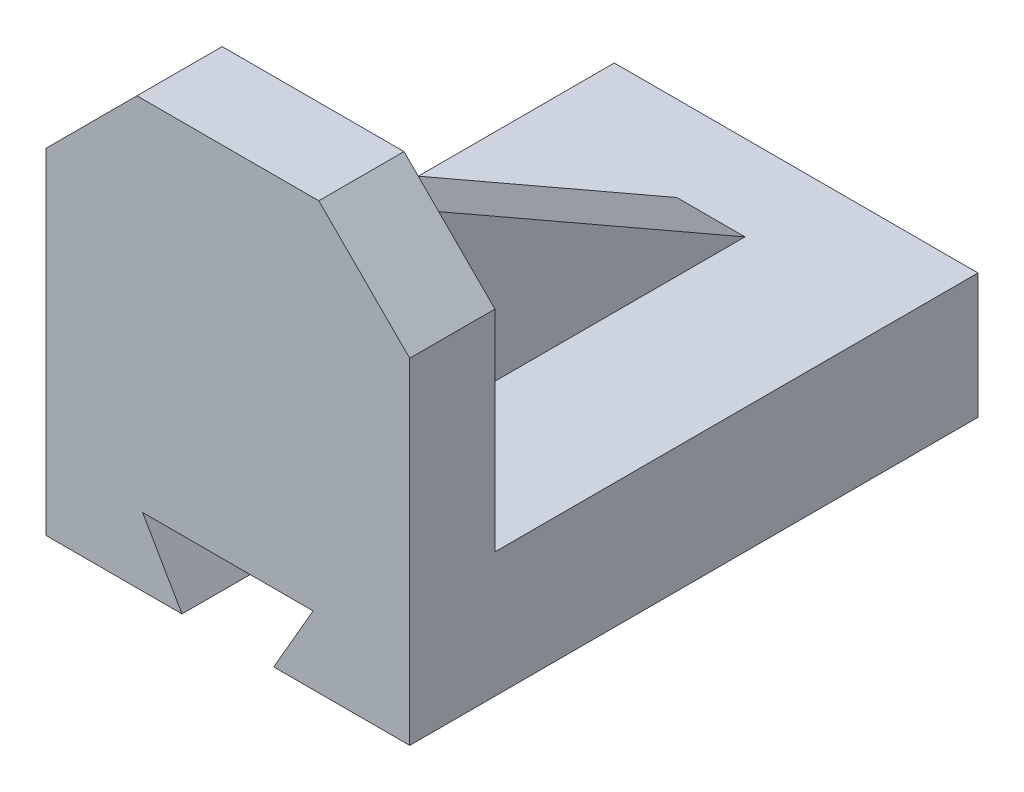
ISO-10303-21;
HEADER;
FILE_DESCRIPTION(('STEP AP214'),'2;1');
FILE_NAME('part.step','',(''),(''),'','','');
FILE_SCHEMA(('AUTOMOTIVE_DESIGN { 1 0 10303 214 1 1 1 1 }'));
ENDSEC;
DATA;
#1=APPLICATION_CONTEXT('core data for automotive mechanical design processes');
#2=APPLICATION_PROTOCOL_DEFINITION('international standard','automotive_design',2000,#1);
#3=PRODUCT_CONTEXT('',#1,'mechanical');
#4=PRODUCT('Part','Part','',(#3));
#5=PRODUCT_RELATED_PRODUCT_CATEGORY('part','',(#4));
#6=PRODUCT_DEFINITION_FORMATION('','',#4);
#7=PRODUCT_DEFINITION_CONTEXT('part definition',#1,'design');
#8=PRODUCT_DEFINITION('design','',#6,#7);
#9=PRODUCT_DEFINITION_SHAPE('','',#8);
#10=(LENGTH_UNIT() NAMED_UNIT(*) SI_UNIT(.MILLI.,.METRE.));
#11=(NAMED_UNIT(*) PLANE_ANGLE_UNIT() SI_UNIT($,.RADIAN.));
#12=(NAMED_UNIT(*) SI_UNIT($,.STERADIAN.) SOLID_ANGLE_UNIT());
#13=UNCERTAINTY_MEASURE_WITH_UNIT(LENGTH_MEASURE(1.E-05),#10,'distance_accuracy_value','');
#14=(GEOMETRIC_REPRESENTATION_CONTEXT(3) GLOBAL_UNCERTAINTY_ASSIGNED_CONTEXT((#13)) GLOBAL_UNIT_ASSIGNED_CONTEXT((#10,
#11,#12)) REPRESENTATION_CONTEXT('',''));
#15=CARTESIAN_POINT('',(0.,0.,0.));
#16=DIRECTION('',(0.,0.,1.));
#17=DIRECTION('',(1.,0.,0.));
#18=AXIS2_PLACEMENT_3D('',#15,#16,#17);
#19=CARTESIAN_POINT('',(32.,-22.,0.));
#20=DIRECTION('',(0.,-1.,0.));
#21=DIRECTION('',(0.,0.,-1.));
#22=AXIS2_PLACEMENT_3D('',#19,#20,#21);
#23=PLANE('',#22);
#24=DIRECTION('',(0.,0.,1.));
#25=VECTOR('',#24,1.);
#26=CARTESIAN_POINT('',(-8.07179676972441,-22.,-85.));
#27=LINE('',#26,#25);
#28=CARTESIAN_POINT('',(-8.07179676972441,-22.,-85.));
#29=VERTEX_POINT('',#28);
#30=CARTESIAN_POINT('',(-8.07179676972441,-22.,15.));
#31=VERTEX_POINT('',#30);
#32=EDGE_CURVE('E297',#29,#31,#27,.T.);
#33=ORIENTED_EDGE('',*,*,#32,.T.);
#34=DIRECTION('',(-1.,0.,0.));
#35=VECTOR('',#34,1.);
#36=CARTESIAN_POINT('',(32.,-22.,15.));
#37=LINE('',#36,#35);
#38=CARTESIAN_POINT('',(-32.,-22.,15.));
#39=VERTEX_POINT('',#38);
#40=EDGE_CURVE('E181',#31,#39,#37,.T.);
#41=ORIENTED_EDGE('',*,*,#40,.T.);
#42=DIRECTION('',(0.,0.,1.));
#43=VECTOR('',#42,1.);
#44=CARTESIAN_POINT('',(-32.,-22.,0.));
#45=LINE('',#44,#43);
#46=CARTESIAN_POINT('',(-32.,-22.,-85.));
#47=VERTEX_POINT('',#46);
#48=EDGE_CURVE('E205',#47,#39,#45,.T.);
#49=ORIENTED_EDGE('',*,*,#48,.F.);
#50=DIRECTION('',(-1.,0.,0.));
#51=VECTOR('',#50,1.);
#52=CARTESIAN_POINT('',(32.,-22.,-85.));
#53=LINE('',#52,#51);
#54=EDGE_CURVE('E230',#29,#47,#53,.T.);
#55=ORIENTED_EDGE('',*,*,#54,.F.);
#56=EDGE_LOOP('',(#33,#41,#49,#55));
#57=FACE_BOUND('',#56,.T.);
#58=ADVANCED_FACE('F45',(#57),#23,.T.);
#59=CARTESIAN_POINT('',(32.,0.,0.));
#60=DIRECTION('',(0.,0.,-1.));
#61=DIRECTION('',(0.,1.,0.));
#62=AXIS2_PLACEMENT_3D('',#59,#60,#61);
#63=PLANE('',#62);
#64=DIRECTION('',(-0.707106781186548,0.707106781186548,0.));
#65=VECTOR('',#64,1.);
#66=CARTESIAN_POINT('',(50.5,18.5,0.));
#67=LINE('',#66,#65);
#68=CARTESIAN_POINT('',(32.,37.,0.));
#69=VERTEX_POINT('',#68);
#70=CARTESIAN_POINT('',(16.,53.,0.));
#71=VERTEX_POINT('',#70);
#72=EDGE_CURVE('E153',#69,#71,#67,.T.);
#73=ORIENTED_EDGE('',*,*,#72,.F.);
#74=DIRECTION('',(0.,-1.,0.));
#75=VECTOR('',#74,1.);
#76=CARTESIAN_POINT('',(32.,0.,0.));
#77=LINE('',#76,#75);
#78=CARTESIAN_POINT('',(32.,0.,0.));
#79=VERTEX_POINT('',#78);
#80=EDGE_CURVE('E223',#69,#79,#77,.T.);
#81=ORIENTED_EDGE('',*,*,#80,.T.);
#82=DIRECTION('',(-1.,0.,0.));
#83=VECTOR('',#82,1.);
#84=CARTESIAN_POINT('',(32.,0.,0.));
#85=LINE('',#84,#83);
#86=CARTESIAN_POINT('',(6.,0.,0.));
#87=VERTEX_POINT('',#86);
#88=EDGE_CURVE('E224',#79,#87,#85,.T.);
#89=ORIENTED_EDGE('',*,*,#88,.T.);
#90=DIRECTION('',(0.,-1.,0.));
#91=VECTOR('',#90,1.);
#92=CARTESIAN_POINT('',(6.,0.,0.));
#93=LINE('',#92,#91);
#94=CARTESIAN_POINT('',(6.,40.,0.));
#95=VERTEX_POINT('',#94);
#96=EDGE_CURVE('E291',#95,#87,#93,.T.);
#97=ORIENTED_EDGE('',*,*,#96,.F.);
#98=DIRECTION('',(-1.,0.,0.));
#99=VECTOR('',#98,1.);
#100=CARTESIAN_POINT('',(6.,40.,0.));
#101=LINE('',#100,#99);
#102=CARTESIAN_POINT('',(-6.,40.,0.));
#103=VERTEX_POINT('',#102);
#104=EDGE_CURVE('E201',#95,#103,#101,.T.);
#105=ORIENTED_EDGE('',*,*,#104,.T.);
#106=DIRECTION('',(0.,-1.,0.));
#107=VECTOR('',#106,1.);
#108=CARTESIAN_POINT('',(-6.,0.,0.));
#109=LINE('',#108,#107);
#110=CARTESIAN_POINT('',(-6.,0.,0.));
#111=VERTEX_POINT('',#110);
#112=EDGE_CURVE('E282',#103,#111,#109,.T.);
#113=ORIENTED_EDGE('',*,*,#112,.T.);
#114=CARTESIAN_POINT('',(-32.,0.,0.));
#115=VERTEX_POINT('',#114);
#116=EDGE_CURVE('E198',#111,#115,#85,.T.);
#117=ORIENTED_EDGE('',*,*,#116,.T.);
#118=DIRECTION('',(0.,-1.,0.));
#119=VECTOR('',#118,1.);
#120=CARTESIAN_POINT('',(-32.,0.,0.));
#121=LINE('',#120,#119);
#122=CARTESIAN_POINT('',(-32.,37.,0.));
#123=VERTEX_POINT('',#122);
#124=EDGE_CURVE('E190',#123,#115,#121,.T.);
#125=ORIENTED_EDGE('',*,*,#124,.F.);
#126=DIRECTION('',(-0.707106781186547,-0.707106781186548,0.));
#127=VECTOR('',#126,1.);
#128=CARTESIAN_POINT('',(-18.5,50.5,0.));
#129=LINE('',#128,#127);
#130=CARTESIAN_POINT('',(-16.,53.,0.));
#131=VERTEX_POINT('',#130);
#132=EDGE_CURVE('E68',#131,#123,#129,.T.);
#133=ORIENTED_EDGE('',*,*,#132,.F.);
#134=DIRECTION('',(-1.,0.,0.));
#135=VECTOR('',#134,1.);
#136=CARTESIAN_POINT('',(32.,53.,0.));
#137=LINE('',#136,#135);
#138=EDGE_CURVE('E174',#71,#131,#137,.T.);
#139=ORIENTED_EDGE('',*,*,#138,.F.);
#140=EDGE_LOOP('',(#73,#81,#89,#97,#105,#113,#117,#125,#133,#139));
#141=FACE_BOUND('',#140,.T.);
#142=ADVANCED_FACE('F47',(#141),#63,.T.);
#143=CARTESIAN_POINT('',(32.,53.,0.));
#144=DIRECTION('',(0.,1.,0.));
#145=DIRECTION('',(0.,0.,1.));
#146=AXIS2_PLACEMENT_3D('',#143,#144,#145);
#147=PLANE('',#146);
#148=DIRECTION('',(0.,0.,1.));
#149=VECTOR('',#148,1.);
#150=CARTESIAN_POINT('',(16.,53.,-85.));
#151=LINE('',#150,#149);
#152=CARTESIAN_POINT('',(16.,53.,15.));
#153=VERTEX_POINT('',#152);
#154=EDGE_CURVE('E150',#71,#153,#151,.T.);
#155=ORIENTED_EDGE('',*,*,#154,.F.);
#156=ORIENTED_EDGE('',*,*,#138,.T.);
#157=DIRECTION('',(0.,0.,1.));
#158=VECTOR('',#157,1.);
#159=CARTESIAN_POINT('',(-16.,53.,-85.));
#160=LINE('',#159,#158);
#161=CARTESIAN_POINT('',(-16.,53.,15.));
#162=VERTEX_POINT('',#161);
#163=EDGE_CURVE('E169',#131,#162,#160,.T.);
#164=ORIENTED_EDGE('',*,*,#163,.T.);
#165=DIRECTION('',(-1.,0.,0.));
#166=VECTOR('',#165,1.);
#167=CARTESIAN_POINT('',(32.,53.,15.));
#168=LINE('',#167,#166);
#169=EDGE_CURVE('E165',#153,#162,#168,.T.);
#170=ORIENTED_EDGE('',*,*,#169,.F.);
#171=EDGE_LOOP('',(#155,#156,#164,#170));
#172=FACE_BOUND('',#171,.T.);
#173=ADVANCED_FACE('F172',(#172),#147,.T.);
#174=CARTESIAN_POINT('',(32.,0.,15.));
#175=DIRECTION('',(0.,0.,1.));
#176=DIRECTION('',(1.,0.,0.));
#177=AXIS2_PLACEMENT_3D('',#174,#175,#176);
#178=PLANE('',#177);
#179=DIRECTION('',(0.707106781186548,-0.707106781186548,0.));
#180=VECTOR('',#179,1.);
#181=CARTESIAN_POINT('',(34.5,34.5,15.));
#182=LINE('',#181,#180);
#183=CARTESIAN_POINT('',(32.,37.,15.));
#184=VERTEX_POINT('',#183);
#185=EDGE_CURVE('E60',#153,#184,#182,.T.);
#186=ORIENTED_EDGE('',*,*,#185,.F.);
#187=ORIENTED_EDGE('',*,*,#169,.T.);
#188=DIRECTION('',(0.707106781186547,0.707106781186548,0.));
#189=VECTOR('',#188,1.);
#190=CARTESIAN_POINT('',(-34.5,34.5,15.));
#191=LINE('',#190,#189);
#192=CARTESIAN_POINT('',(-32.,37.,15.));
#193=VERTEX_POINT('',#192);
#194=EDGE_CURVE('E333',#193,#162,#191,.T.);
#195=ORIENTED_EDGE('',*,*,#194,.F.);
#196=DIRECTION('',(0.,1.,0.));
#197=VECTOR('',#196,1.);
#198=CARTESIAN_POINT('',(-32.,0.,15.));
#199=LINE('',#198,#197);
#200=EDGE_CURVE('E194',#39,#193,#199,.T.);
#201=ORIENTED_EDGE('',*,*,#200,.F.);
#202=ORIENTED_EDGE('',*,*,#40,.F.);
#203=DIRECTION('',(0.500000000000004,-0.866025403784436,0.));
#204=VECTOR('',#203,1.);
#205=CARTESIAN_POINT('',(-15.5801270189222,-8.99519052838337,15.));
#206=LINE('',#205,#204);
#207=CARTESIAN_POINT('',(-15.,-10.,15.));
#208=VERTEX_POINT('',#207);
#209=EDGE_CURVE('E324',#208,#31,#206,.T.);
#210=ORIENTED_EDGE('',*,*,#209,.F.);
#211=DIRECTION('',(-1.,0.,0.));
#212=VECTOR('',#211,1.);
#213=CARTESIAN_POINT('',(0.,-10.,15.));
#214=LINE('',#213,#212);
#215=CARTESIAN_POINT('',(15.,-9.99999999999999,15.));
#216=VERTEX_POINT('',#215);
#217=EDGE_CURVE('E316',#216,#208,#214,.T.);
#218=ORIENTED_EDGE('',*,*,#217,.F.);
#219=DIRECTION('',(0.500000000000004,0.866025403784436,0.));
#220=VECTOR('',#219,1.);
#221=CARTESIAN_POINT('',(15.5801270189222,-8.99519052838336,15.));
#222=LINE('',#221,#220);
#223=CARTESIAN_POINT('',(8.07179676972442,-22.,15.));
#224=VERTEX_POINT('',#223);
#225=EDGE_CURVE('E320',#224,#216,#222,.T.);
#226=ORIENTED_EDGE('',*,*,#225,.F.);
#227=CARTESIAN_POINT('',(32.,-22.,15.));
#228=VERTEX_POINT('',#227);
#229=EDGE_CURVE('E175',#228,#224,#37,.T.);
#230=ORIENTED_EDGE('',*,*,#229,.F.);
#231=DIRECTION('',(0.,1.,0.));
#232=VECTOR('',#231,1.);
#233=CARTESIAN_POINT('',(32.,0.,15.));
#234=LINE('',#233,#232);
#235=EDGE_CURVE('E167',#228,#184,#234,.T.);
#236=ORIENTED_EDGE('',*,*,#235,.T.);
#237=EDGE_LOOP('',(#186,#187,#195,#201,#202,#210,#218,#226,#230,#236));
#238=FACE_BOUND('',#237,.T.);
#239=ADVANCED_FACE('F163',(#238),#178,.T.);
#240=DIRECTION('',(0.,0.,1.));
#241=VECTOR('',#240,1.);
#242=CARTESIAN_POINT('',(8.07179676972442,-22.,-85.));
#243=LINE('',#242,#241);
#244=CARTESIAN_POINT('',(8.07179676972442,-22.,-85.));
#245=VERTEX_POINT('',#244);
#246=EDGE_CURVE('E300',#245,#224,#243,.T.);
#247=ORIENTED_EDGE('',*,*,#246,.F.);
#248=CARTESIAN_POINT('',(32.,-22.,-85.));
#249=VERTEX_POINT('',#248);
#250=EDGE_CURVE('E231',#249,#245,#53,.T.);
#251=ORIENTED_EDGE('',*,*,#250,.F.);
#252=DIRECTION('',(0.,0.,1.));
#253=VECTOR('',#252,1.);
#254=CARTESIAN_POINT('',(32.,-22.,0.));
#255=LINE('',#254,#253);
#256=EDGE_CURVE('E264',#249,#228,#255,.T.);
#257=ORIENTED_EDGE('',*,*,#256,.T.);
#258=ORIENTED_EDGE('',*,*,#229,.T.);
#259=EDGE_LOOP('',(#247,#251,#257,#258));
#260=FACE_BOUND('',#259,.T.);
#261=ADVANCED_FACE('F348',(#260),#23,.T.);
#262=CARTESIAN_POINT('',(32.,0.,-85.));
#263=DIRECTION('',(0.,0.,-1.));
#264=DIRECTION('',(-1.,0.,0.));
#265=AXIS2_PLACEMENT_3D('',#262,#263,#264);
#266=PLANE('',#265);
#267=DIRECTION('',(0.500000000000004,-0.866025403784436,0.));
#268=VECTOR('',#267,1.);
#269=CARTESIAN_POINT('',(-15.5801270189222,-8.99519052838337,-85.));
#270=LINE('',#269,#268);
#271=CARTESIAN_POINT('',(-15.,-10.,-85.));
#272=VERTEX_POINT('',#271);
#273=EDGE_CURVE('E246',#272,#29,#270,.T.);
#274=ORIENTED_EDGE('',*,*,#273,.T.);
#275=ORIENTED_EDGE('',*,*,#54,.T.);
#276=DIRECTION('',(0.,-1.,0.));
#277=VECTOR('',#276,1.);
#278=CARTESIAN_POINT('',(-32.,0.,-85.));
#279=LINE('',#278,#277);
#280=CARTESIAN_POINT('',(-32.,0.,-85.));
#281=VERTEX_POINT('',#280);
#282=EDGE_CURVE('E216',#281,#47,#279,.T.);
#283=ORIENTED_EDGE('',*,*,#282,.F.);
#284=DIRECTION('',(-1.,0.,0.));
#285=VECTOR('',#284,1.);
#286=CARTESIAN_POINT('',(32.,0.,-85.));
#287=LINE('',#286,#285);
#288=CARTESIAN_POINT('',(32.,0.,-85.));
#289=VERTEX_POINT('',#288);
#290=EDGE_CURVE('E228',#289,#281,#287,.T.);
#291=ORIENTED_EDGE('',*,*,#290,.F.);
#292=DIRECTION('',(0.,-1.,0.));
#293=VECTOR('',#292,1.);
#294=CARTESIAN_POINT('',(32.,0.,-85.));
#295=LINE('',#294,#293);
#296=EDGE_CURVE('E258',#289,#249,#295,.T.);
#297=ORIENTED_EDGE('',*,*,#296,.T.);
#298=ORIENTED_EDGE('',*,*,#250,.T.);
#299=DIRECTION('',(0.500000000000004,0.866025403784436,0.));
#300=VECTOR('',#299,1.);
#301=CARTESIAN_POINT('',(15.5801270189222,-8.99519052838336,-85.));
#302=LINE('',#301,#300);
#303=CARTESIAN_POINT('',(15.,-9.99999999999999,-85.));
#304=VERTEX_POINT('',#303);
#305=EDGE_CURVE('E311',#245,#304,#302,.T.);
#306=ORIENTED_EDGE('',*,*,#305,.T.);
#307=DIRECTION('',(-1.,0.,0.));
#308=VECTOR('',#307,1.);
#309=CARTESIAN_POINT('',(0.,-10.,-85.));
#310=LINE('',#309,#308);
#311=EDGE_CURVE('E301',#304,#272,#310,.T.);
#312=ORIENTED_EDGE('',*,*,#311,.T.);
#313=EDGE_LOOP('',(#274,#275,#283,#291,#297,#298,#306,#312));
#314=FACE_BOUND('',#313,.T.);
#315=ADVANCED_FACE('F243',(#314),#266,.T.);
#316=CARTESIAN_POINT('',(32.,0.,0.));
#317=DIRECTION('',(0.,1.,0.));
#318=DIRECTION('',(0.,0.,1.));
#319=AXIS2_PLACEMENT_3D('',#316,#317,#318);
#320=PLANE('',#319);
#321=DIRECTION('',(0.,0.,-1.));
#322=VECTOR('',#321,1.);
#323=CARTESIAN_POINT('',(6.,0.,0.));
#324=LINE('',#323,#322);
#325=CARTESIAN_POINT('',(6.,0.,-70.));
#326=VERTEX_POINT('',#325);
#327=EDGE_CURVE('E277',#87,#326,#324,.T.);
#328=ORIENTED_EDGE('',*,*,#327,.F.);
#329=ORIENTED_EDGE('',*,*,#88,.F.);
#330=DIRECTION('',(0.,0.,-1.));
#331=VECTOR('',#330,1.);
#332=CARTESIAN_POINT('',(32.,0.,0.));
#333=LINE('',#332,#331);
#334=EDGE_CURVE('E211',#79,#289,#333,.T.);
#335=ORIENTED_EDGE('',*,*,#334,.T.);
#336=ORIENTED_EDGE('',*,*,#290,.T.);
#337=DIRECTION('',(0.,0.,-1.));
#338=VECTOR('',#337,1.);
#339=CARTESIAN_POINT('',(-32.,0.,0.));
#340=LINE('',#339,#338);
#341=EDGE_CURVE('E220',#115,#281,#340,.T.);
#342=ORIENTED_EDGE('',*,*,#341,.F.);
#343=ORIENTED_EDGE('',*,*,#116,.F.);
#344=DIRECTION('',(0.,0.,-1.));
#345=VECTOR('',#344,1.);
#346=CARTESIAN_POINT('',(-6.,0.,0.));
#347=LINE('',#346,#345);
#348=CARTESIAN_POINT('',(-6.,0.,-70.));
#349=VERTEX_POINT('',#348);
#350=EDGE_CURVE('E278',#111,#349,#347,.T.);
#351=ORIENTED_EDGE('',*,*,#350,.T.);
#352=DIRECTION('',(-1.,0.,0.));
#353=VECTOR('',#352,1.);
#354=CARTESIAN_POINT('',(6.,0.,-70.));
#355=LINE('',#354,#353);
#356=EDGE_CURVE('E208',#326,#349,#355,.T.);
#357=ORIENTED_EDGE('',*,*,#356,.F.);
#358=EDGE_LOOP('',(#328,#329,#335,#336,#342,#343,#351,#357));
#359=FACE_BOUND('',#358,.T.);
#360=ADVANCED_FACE('F252',(#359),#320,.T.);
#361=CARTESIAN_POINT('',(32.,0.,0.));
#362=DIRECTION('',(1.,0.,0.));
#363=DIRECTION('',(0.,0.,-1.));
#364=AXIS2_PLACEMENT_3D('',#361,#362,#363);
#365=PLANE('',#364);
#366=DIRECTION('',(0.,0.,-1.));
#367=VECTOR('',#366,1.);
#368=CARTESIAN_POINT('',(32.,37.,0.));
#369=LINE('',#368,#367);
#370=EDGE_CURVE('E11',#184,#69,#369,.T.);
#371=ORIENTED_EDGE('',*,*,#370,.F.);
#372=ORIENTED_EDGE('',*,*,#235,.F.);
#373=ORIENTED_EDGE('',*,*,#256,.F.);
#374=ORIENTED_EDGE('',*,*,#296,.F.);
#375=ORIENTED_EDGE('',*,*,#334,.F.);
#376=ORIENTED_EDGE('',*,*,#80,.F.);
#377=EDGE_LOOP('',(#371,#372,#373,#374,#375,#376));
#378=FACE_BOUND('',#377,.T.);
#379=ADVANCED_FACE('F261',(#378),#365,.T.);
#380=CARTESIAN_POINT('',(-32.,0.,0.));
#381=DIRECTION('',(1.,0.,0.));
#382=DIRECTION('',(0.,0.,-1.));
#383=AXIS2_PLACEMENT_3D('',#380,#381,#382);
#384=PLANE('',#383);
#385=ORIENTED_EDGE('',*,*,#200,.T.);
#386=DIRECTION('',(0.,0.,-1.));
#387=VECTOR('',#386,1.);
#388=CARTESIAN_POINT('',(-32.,37.,0.));
#389=LINE('',#388,#387);
#390=EDGE_CURVE('E54',#193,#123,#389,.T.);
#391=ORIENTED_EDGE('',*,*,#390,.T.);
#392=ORIENTED_EDGE('',*,*,#124,.T.);
#393=ORIENTED_EDGE('',*,*,#341,.T.);
#394=ORIENTED_EDGE('',*,*,#282,.T.);
#395=ORIENTED_EDGE('',*,*,#48,.T.);
#396=EDGE_LOOP('',(#385,#391,#392,#393,#394,#395));
#397=FACE_BOUND('',#396,.T.);
#398=ADVANCED_FACE('F188',(#397),#384,.F.);
#399=CARTESIAN_POINT('',(6.,30.1538461538462,-17.2307692307692));
#400=DIRECTION('',(0.,0.868243142124459,-0.496138938356834));
#401=DIRECTION('',(0.,0.496138938356834,0.868243142124459));
#402=AXIS2_PLACEMENT_3D('',#399,#400,#401);
#403=PLANE('',#402);
#404=DIRECTION('',(0.,-0.496138938356834,-0.868243142124459));
#405=VECTOR('',#404,1.);
#406=CARTESIAN_POINT('',(-6.,30.1538461538462,-17.2307692307692));
#407=LINE('',#406,#405);
#408=EDGE_CURVE('E285',#103,#349,#407,.T.);
#409=ORIENTED_EDGE('',*,*,#408,.F.);
#410=ORIENTED_EDGE('',*,*,#104,.F.);
#411=DIRECTION('',(0.,-0.496138938356834,-0.868243142124459));
#412=VECTOR('',#411,1.);
#413=CARTESIAN_POINT('',(6.,30.1538461538462,-17.2307692307692));
#414=LINE('',#413,#412);
#415=EDGE_CURVE('E281',#95,#326,#414,.T.);
#416=ORIENTED_EDGE('',*,*,#415,.T.);
#417=ORIENTED_EDGE('',*,*,#356,.T.);
#418=EDGE_LOOP('',(#409,#410,#416,#417));
#419=FACE_BOUND('',#418,.T.);
#420=ADVANCED_FACE('F392',(#419),#403,.T.);
#421=CARTESIAN_POINT('',(6.,0.,0.));
#422=DIRECTION('',(1.,0.,0.));
#423=DIRECTION('',(0.,0.,-1.));
#424=AXIS2_PLACEMENT_3D('',#421,#422,#423);
#425=PLANE('',#424);
#426=ORIENTED_EDGE('',*,*,#415,.F.);
#427=ORIENTED_EDGE('',*,*,#96,.T.);
#428=ORIENTED_EDGE('',*,*,#327,.T.);
#429=EDGE_LOOP('',(#426,#427,#428));
#430=FACE_BOUND('',#429,.T.);
#431=ADVANCED_FACE('F456',(#430),#425,.T.);
#432=CARTESIAN_POINT('',(-6.,0.,0.));
#433=DIRECTION('',(1.,0.,0.));
#434=DIRECTION('',(0.,0.,-1.));
#435=AXIS2_PLACEMENT_3D('',#432,#433,#434);
#436=PLANE('',#435);
#437=ORIENTED_EDGE('',*,*,#408,.T.);
#438=ORIENTED_EDGE('',*,*,#350,.F.);
#439=ORIENTED_EDGE('',*,*,#112,.F.);
#440=EDGE_LOOP('',(#437,#438,#439));
#441=FACE_BOUND('',#440,.T.);
#442=ADVANCED_FACE('F440',(#441),#436,.F.);
#443=CARTESIAN_POINT('',(-15.5801270189222,-8.99519052838337,-85.));
#444=DIRECTION('',(-0.866025403784436,-0.500000000000004,0.));
#445=DIRECTION('',(0.500000000000004,-0.866025403784436,0.));
#446=AXIS2_PLACEMENT_3D('',#443,#444,#445);
#447=PLANE('',#446);
#448=ORIENTED_EDGE('',*,*,#32,.F.);
#449=ORIENTED_EDGE('',*,*,#273,.F.);
#450=DIRECTION('',(0.,0.,1.));
#451=VECTOR('',#450,1.);
#452=CARTESIAN_POINT('',(-15.,-10.,-85.));
#453=LINE('',#452,#451);
#454=EDGE_CURVE('E288',#272,#208,#453,.T.);
#455=ORIENTED_EDGE('',*,*,#454,.T.);
#456=ORIENTED_EDGE('',*,*,#209,.T.);
#457=EDGE_LOOP('',(#448,#449,#455,#456));
#458=FACE_BOUND('',#457,.T.);
#459=ADVANCED_FACE('F340',(#458),#447,.F.);
#460=CARTESIAN_POINT('',(0.,-10.,-85.));
#461=DIRECTION('',(0.,1.,0.));
#462=DIRECTION('',(-1.,0.,0.));
#463=AXIS2_PLACEMENT_3D('',#460,#461,#462);
#464=PLANE('',#463);
#465=ORIENTED_EDGE('',*,*,#454,.F.);
#466=ORIENTED_EDGE('',*,*,#311,.F.);
#467=DIRECTION('',(0.,0.,1.));
#468=VECTOR('',#467,1.);
#469=CARTESIAN_POINT('',(15.,-9.99999999999999,-85.));
#470=LINE('',#469,#468);
#471=EDGE_CURVE('E304',#304,#216,#470,.T.);
#472=ORIENTED_EDGE('',*,*,#471,.T.);
#473=ORIENTED_EDGE('',*,*,#217,.T.);
#474=EDGE_LOOP('',(#465,#466,#472,#473));
#475=FACE_BOUND('',#474,.T.);
#476=ADVANCED_FACE('F342',(#475),#464,.F.);
#477=CARTESIAN_POINT('',(15.5801270189222,-8.99519052838336,-85.));
#478=DIRECTION('',(0.866025403784436,-0.500000000000004,0.));
#479=DIRECTION('',(0.500000000000004,0.866025403784436,0.));
#480=AXIS2_PLACEMENT_3D('',#477,#478,#479);
#481=PLANE('',#480);
#482=ORIENTED_EDGE('',*,*,#471,.F.);
#483=ORIENTED_EDGE('',*,*,#305,.F.);
#484=ORIENTED_EDGE('',*,*,#246,.T.);
#485=ORIENTED_EDGE('',*,*,#225,.T.);
#486=EDGE_LOOP('',(#482,#483,#484,#485));
#487=FACE_BOUND('',#486,.T.);
#488=ADVANCED_FACE('F345',(#487),#481,.F.);
#489=CARTESIAN_POINT('',(-34.5,34.5,-85.));
#490=DIRECTION('',(0.707106781186548,-0.707106781186547,0.));
#491=DIRECTION('',(0.707106781186547,0.707106781186548,0.));
#492=AXIS2_PLACEMENT_3D('',#489,#490,#491);
#493=PLANE('',#492);
#494=ORIENTED_EDGE('',*,*,#132,.T.);
#495=ORIENTED_EDGE('',*,*,#390,.F.);
#496=ORIENTED_EDGE('',*,*,#194,.T.);
#497=ORIENTED_EDGE('',*,*,#163,.F.);
#498=EDGE_LOOP('',(#494,#495,#496,#497));
#499=FACE_BOUND('',#498,.T.);
#500=ADVANCED_FACE('F335',(#499),#493,.F.);
#501=CARTESIAN_POINT('',(34.5,34.5,-85.));
#502=DIRECTION('',(-0.707106781186547,-0.707106781186547,0.));
#503=DIRECTION('',(0.707106781186548,-0.707106781186548,0.));
#504=AXIS2_PLACEMENT_3D('',#501,#502,#503);
#505=PLANE('',#504);
#506=ORIENTED_EDGE('',*,*,#72,.T.);
#507=ORIENTED_EDGE('',*,*,#154,.T.);
#508=ORIENTED_EDGE('',*,*,#185,.T.);
#509=ORIENTED_EDGE('',*,*,#370,.T.);
#510=EDGE_LOOP('',(#506,#507,#508,#509));
#511=FACE_BOUND('',#510,.T.);
#512=ADVANCED_FACE('F151',(#511),#505,.F.);
#513=CLOSED_SHELL('',(#58,#142,#173,#239,#261,#315,#360,#379,#398,#420,#431,#442,#459,#476,#488,
#500,#512));
#514=MANIFOLD_SOLID_BREP('B2',#513);
#515=ADVANCED_BREP_SHAPE_REPRESENTATION('',(#18,#514),#14);
#516=SHAPE_DEFINITION_REPRESENTATION(#9,#515);
ENDSEC;
END-ISO-10303-21;
